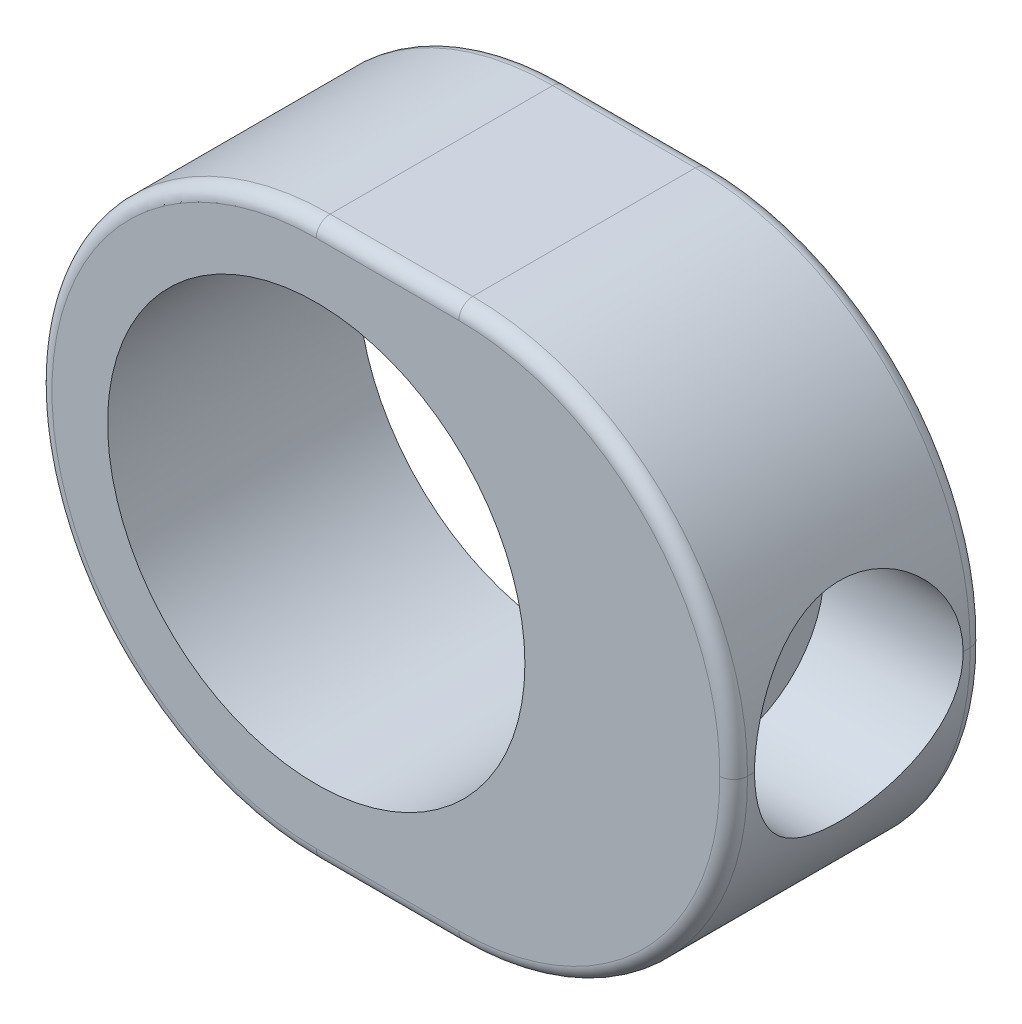
ISO-10303-21;
HEADER;
FILE_DESCRIPTION(('STEP AP214'),'2;1');
FILE_NAME('part.step','',(''),(''),'','','');
FILE_SCHEMA(('AUTOMOTIVE_DESIGN { 1 0 10303 214 1 1 1 1 }'));
ENDSEC;
DATA;
#1=APPLICATION_CONTEXT('core data for automotive mechanical design processes');
#2=APPLICATION_PROTOCOL_DEFINITION('international standard','automotive_design',2000,#1);
#3=PRODUCT_CONTEXT('',#1,'mechanical');
#4=PRODUCT('Part','Part','',(#3));
#5=PRODUCT_RELATED_PRODUCT_CATEGORY('part','',(#4));
#6=PRODUCT_DEFINITION_FORMATION('','',#4);
#7=PRODUCT_DEFINITION_CONTEXT('part definition',#1,'design');
#8=PRODUCT_DEFINITION('design','',#6,#7);
#9=PRODUCT_DEFINITION_SHAPE('','',#8);
#10=(LENGTH_UNIT() NAMED_UNIT(*) SI_UNIT(.MILLI.,.METRE.));
#11=(NAMED_UNIT(*) PLANE_ANGLE_UNIT() SI_UNIT($,.RADIAN.));
#12=(NAMED_UNIT(*) SI_UNIT($,.STERADIAN.) SOLID_ANGLE_UNIT());
#13=UNCERTAINTY_MEASURE_WITH_UNIT(LENGTH_MEASURE(1.E-05),#10,'distance_accuracy_value','');
#14=(GEOMETRIC_REPRESENTATION_CONTEXT(3) GLOBAL_UNCERTAINTY_ASSIGNED_CONTEXT((#13)) GLOBAL_UNIT_ASSIGNED_CONTEXT((#10,
#11,#12)) REPRESENTATION_CONTEXT('',''));
#15=CARTESIAN_POINT('',(0.,0.,0.));
#16=DIRECTION('',(0.,0.,1.));
#17=DIRECTION('',(1.,0.,0.));
#18=AXIS2_PLACEMENT_3D('',#15,#16,#17);
#19=CARTESIAN_POINT('',(20.503164683737,-0.5,18.));
#20=DIRECTION('',(0.,0.,-1.));
#21=DIRECTION('',(-1.,0.,0.));
#22=AXIS2_PLACEMENT_3D('',#19,#20,#21);
#23=CYLINDRICAL_SURFACE('',#22,39.5);
#24=DIRECTION('',(0.,0.,-1.));
#25=VECTOR('',#24,1.);
#26=CARTESIAN_POINT('',(20.503164683737,-40.,18.));
#27=LINE('',#26,#25);
#28=CARTESIAN_POINT('',(20.503164683737,-40.,16.));
#29=VERTEX_POINT('',#28);
#30=CARTESIAN_POINT('',(20.503164683737,-40.,-16.));
#31=VERTEX_POINT('',#30);
#32=EDGE_CURVE('E142',#29,#31,#27,.T.);
#33=ORIENTED_EDGE('',*,*,#32,.T.);
#34=CARTESIAN_POINT('',(20.503164683737,-0.5,-16.));
#35=DIRECTION('',(0.,0.,1.));
#36=DIRECTION('',(1.,0.,0.));
#37=AXIS2_PLACEMENT_3D('',#34,#35,#36);
#38=CIRCLE('',#37,39.5);
#39=CARTESIAN_POINT('',(60.,0.,-16.));
#40=VERTEX_POINT('',#39);
#41=EDGE_CURVE('E378',#31,#40,#38,.T.);
#42=ORIENTED_EDGE('',*,*,#41,.T.);
#43=DIRECTION('',(0.,0.,-1.));
#44=VECTOR('',#43,1.);
#45=CARTESIAN_POINT('',(60.,0.,18.));
#46=LINE('',#45,#44);
#47=CARTESIAN_POINT('',(60.,0.,-15.));
#48=VERTEX_POINT('',#47);
#49=EDGE_CURVE('E143',#48,#40,#46,.T.);
#50=ORIENTED_EDGE('',*,*,#49,.F.);
#51=CARTESIAN_POINT('',(60.,0.,15.));
#52=CARTESIAN_POINT('',(60.0025678408984,-0.20268748840878,15.0000006035009));
#53=CARTESIAN_POINT('',(60.0035706861601,-0.405368792643126,14.9958910075069));
#54=CARTESIAN_POINT('',(60.0024640671334,-0.810383275781215,14.9794646518959));
#55=CARTESIAN_POINT('',(60.0003547071752,-1.01271646612712,14.9671481674057));
#56=CARTESIAN_POINT('',(59.9893884076811,-1.6185191143819,14.9179233834016));
#57=CARTESIAN_POINT('',(59.9758956484686,-2.02098446942587,14.8687397254048));
#58=CARTESIAN_POINT('',(59.9370652817856,-2.81874161068317,14.7383042444344));
#59=CARTESIAN_POINT('',(59.911764894015,-3.2140519123791,14.6571533123197));
#60=CARTESIAN_POINT('',(59.8501007544488,-3.9960612184822,14.4635312373196));
#61=CARTESIAN_POINT('',(59.813736669792,-4.38275996342721,14.3510591521178));
#62=CARTESIAN_POINT('',(59.7310094212115,-5.14467215747707,14.0958745528617));
#63=CARTESIAN_POINT('',(59.6846521552448,-5.51989223274604,13.9531798769889));
#64=CARTESIAN_POINT('',(59.5831916526666,-6.25671936349273,13.6386924645677));
#65=CARTESIAN_POINT('',(59.5280879045826,-6.6183256213372,13.4668980262975));
#66=CARTESIAN_POINT('',(59.4105613327311,-7.32592096774218,13.0954434953834));
#67=CARTESIAN_POINT('',(59.348134687917,-7.67190177145621,12.8957688445662));
#68=CARTESIAN_POINT('',(59.2175903640913,-8.34609213756379,12.4700323675246));
#69=CARTESIAN_POINT('',(59.1494725428876,-8.67430125560011,12.2439698819533));
#70=CARTESIAN_POINT('',(59.0066916983673,-9.32284915792936,11.7581714700518));
#71=CARTESIAN_POINT('',(58.9318802788839,-9.64245839174393,11.4975049331854));
#72=CARTESIAN_POINT('',(58.7799619017773,-10.2589781702006,10.9509431826881));
#73=CARTESIAN_POINT('',(58.7028539651049,-10.5558788355795,10.6650371039159));
#74=CARTESIAN_POINT('',(58.5484201756727,-11.1252332364311,10.0697013641065));
#75=CARTESIAN_POINT('',(58.4710942585987,-11.3976787539636,9.76026385958395));
#76=CARTESIAN_POINT('',(58.3183948077789,-11.9162788970213,9.11986799047147));
#77=CARTESIAN_POINT('',(58.2430204504717,-12.1624447542387,8.78891891782194));
#78=CARTESIAN_POINT('',(58.0933312439587,-12.6364593130683,8.09345750748559));
#79=CARTESIAN_POINT('',(58.0191823945208,-12.8631652971093,7.72812921123432));
#80=CARTESIAN_POINT('',(57.8775762140241,-13.2848685841253,6.97834297436058));
#81=CARTESIAN_POINT('',(57.810119101712,-13.4798648506714,6.59388440900346));
#82=CARTESIAN_POINT('',(57.6841401389698,-13.8364476415856,5.80849729179803));
#83=CARTESIAN_POINT('',(57.6256154287768,-13.9980448647536,5.40757406360042));
#84=CARTESIAN_POINT('',(57.5195020787645,-14.2863846350347,4.59197832011602));
#85=CARTESIAN_POINT('',(57.471912844006,-14.4131290783702,4.17730655421699));
#86=CARTESIAN_POINT('',(57.3909207429949,-14.6264287349907,3.35292186150705));
#87=CARTESIAN_POINT('',(57.3570575980606,-14.7142989756503,2.94359442968668));
#88=CARTESIAN_POINT('',(57.3022506570644,-14.8555925359863,2.11817561556694));
#89=CARTESIAN_POINT('',(57.2813065669747,-14.9090166396313,1.70208438742757));
#90=CARTESIAN_POINT('',(57.2530963991491,-14.9808153582694,0.86656178410691));
#91=CARTESIAN_POINT('',(57.2458258447524,-14.9992014445948,0.447131547282433));
#92=CARTESIAN_POINT('',(57.2452159465281,-15.0007475212642,-0.391795779949764));
#93=CARTESIAN_POINT('',(57.2518760695792,-14.9839088596444,-0.811292867184814));
#94=CARTESIAN_POINT('',(57.2780946449758,-14.9172013706989,-1.62267419420308));
#95=CARTESIAN_POINT('',(57.2968818593942,-14.8693068067355,-2.01474766553545));
#96=CARTESIAN_POINT('',(57.345991350649,-14.7429180443422,-2.79317697717157));
#97=CARTESIAN_POINT('',(57.376313117744,-14.6644251981248,-3.17953306935715));
#98=CARTESIAN_POINT('',(57.4475505278599,-14.4775653692412,-3.94397630277603));
#99=CARTESIAN_POINT('',(57.4884671093371,-14.3691957401261,-4.3220627082869));
#100=CARTESIAN_POINT('',(57.5796628247883,-14.1235250570078,-5.06755185128892));
#101=CARTESIAN_POINT('',(57.6299422515786,-13.9862230981495,-5.43495425423008));
#102=CARTESIAN_POINT('',(57.7393557146436,-13.6811522582491,-6.16316573259671));
#103=CARTESIAN_POINT('',(57.7986283556239,-13.5128957004934,-6.52374951130485));
#104=CARTESIAN_POINT('',(57.9236923305531,-13.148761324539,-7.22965169369374));
#105=CARTESIAN_POINT('',(57.9894858786148,-12.9528741149922,-7.57496485442802));
#106=CARTESIAN_POINT('',(58.1257851505681,-12.5348142728184,-8.2483641457647));
#107=CARTESIAN_POINT('',(58.1962914189855,-12.3126386004289,-8.57644827781133));
#108=CARTESIAN_POINT('',(58.34015748141,-11.8433766730301,-9.21363115173639));
#109=CARTESIAN_POINT('',(58.4135173925975,-11.5962893943987,-9.52272911262954));
#110=CARTESIAN_POINT('',(58.5659889913566,-11.0618885680037,-10.1396110455137));
#111=CARTESIAN_POINT('',(58.6451663733164,-10.7730081468667,-10.4460232353462));
#112=CARTESIAN_POINT('',(58.8023705607463,-10.1704565918904,-11.0335318054083));
#113=CARTESIAN_POINT('',(58.8803977129236,-9.85679311738492,-11.3146359502068));
#114=CARTESIAN_POINT('',(59.0331783685077,-9.20630193525748,-11.8499578740072));
#115=CARTESIAN_POINT('',(59.1079303762142,-8.8694638210079,-12.1041634423752));
#116=CARTESIAN_POINT('',(59.2520177137397,-8.17477721865735,-12.5837657413823));
#117=CARTESIAN_POINT('',(59.321353206732,-7.81692936404712,-12.8091633399958));
#118=CARTESIAN_POINT('',(59.4534899307952,-7.07761233527592,-13.2322010229482));
#119=CARTESIAN_POINT('',(59.5161936033943,-6.69589502810454,-13.4294385575695));
#120=CARTESIAN_POINT('',(59.6321282317366,-5.9156945780758,-13.790917935437));
#121=CARTESIAN_POINT('',(59.6853581605179,-5.51720962337307,-13.955156201783));
#122=CARTESIAN_POINT('',(59.7806172694807,-4.70688600262124,-14.2488837392368));
#123=CARTESIAN_POINT('',(59.8226604718654,-4.29506478679739,-14.3784165139975));
#124=CARTESIAN_POINT('',(59.8942539054707,-3.46095530039465,-14.60164822741));
#125=CARTESIAN_POINT('',(59.9238094526484,-3.03867156488987,-14.6953624123033));
#126=CARTESIAN_POINT('',(59.9696972067402,-2.18190654576166,-14.846905383133));
#127=CARTESIAN_POINT('',(59.9858738293944,-1.74734090792212,-14.9043101682281));
#128=CARTESIAN_POINT('',(59.9993140623349,-1.0931391194621,-14.9617169610482));
#129=CARTESIAN_POINT('',(60.0019912112039,-0.874775322800255,-14.9760691494335));
#130=CARTESIAN_POINT('',(60.0037205260251,-0.437610973492026,-14.9952111403534));
#131=CARTESIAN_POINT('',(60.0027726295353,-0.218810413387182,-15.0000007781688));
#132=CARTESIAN_POINT('',(60.,0.,-15.));
#133=B_SPLINE_CURVE_WITH_KNOTS('',3,(#51,#52,#53,#54,#55,#56,#57,#58,#59,#60,#61,#62,#63,#64,
#65,#66,#67,#68,#69,#70,#71,#72,#73,#74,#75,#76,#77,#78,#79,#80,#81,#82,#83,#84,#85,#86,#87,#88,
#89,#90,#91,#92,#93,#94,#95,#96,#97,#98,#99,#100,#101,#102,#103,#104,#105,#106,#107,#108,#109,
#110,#111,#112,#113,#114,#115,#116,#117,#118,#119,#120,#121,#122,#123,#124,#125,#126,#127,#128,
#129,#130,#131,#132),.UNSPECIFIED.,.F.,.F.,(4,2,2,2,2,2,2,2,2,2,2,2,2,2,2,2,2,2,2,2,2,2,2,2,2,2,
2,2,2,2,2,2,2,2,2,2,2,2,2,2,4),(0.,0.608011795434432,1.2160032089834,2.43140949498945,
3.64301022082166,4.8546474023587,6.06557142625138,7.2765662880902,8.48819587486417,
9.69985574283849,10.9559322371555,12.212552110038,13.4695926904939,14.7260938538559,
16.0333879945179,17.3407248553654,18.6476422823995,19.9544885903799,21.2129162929076,
22.4713153535391,23.7293023476037,24.9872411999143,26.1721524130091,27.3570112679331,
28.541975109951,29.7269760170751,30.9325554372453,32.1385456121519,33.3446753734882,
34.5508547151024,35.8348649800721,37.1184799555221,38.4026751516968,39.686831646376,
40.9878199672855,42.2889492306532,43.5884398039017,44.8873766292223,46.2012145204661,
46.8575615635148,47.513919912335),.UNSPECIFIED.);
#134=CARTESIAN_POINT('',(60.,0.,15.));
#135=VERTEX_POINT('',#134);
#136=EDGE_CURVE('E147',#135,#48,#133,.T.);
#137=ORIENTED_EDGE('',*,*,#136,.F.);
#138=CARTESIAN_POINT('',(60.,0.,16.));
#139=VERTEX_POINT('',#138);
#140=EDGE_CURVE('E130',#139,#135,#46,.T.);
#141=ORIENTED_EDGE('',*,*,#140,.F.);
#142=CARTESIAN_POINT('',(20.503164683737,-0.5,16.));
#143=DIRECTION('',(0.,0.,1.));
#144=DIRECTION('',(1.,0.,0.));
#145=AXIS2_PLACEMENT_3D('',#142,#143,#144);
#146=CIRCLE('',#145,39.5);
#147=EDGE_CURVE('E374',#139,#29,#146,.F.);
#148=ORIENTED_EDGE('',*,*,#147,.T.);
#149=EDGE_LOOP('',(#33,#42,#50,#137,#141,#148));
#150=FACE_BOUND('',#149,.T.);
#151=ADVANCED_FACE('F45',(#150),#23,.T.);
#152=CARTESIAN_POINT('',(20.503164683737,0.5,18.));
#153=DIRECTION('',(0.,0.,-1.));
#154=DIRECTION('',(-1.,0.,0.));
#155=AXIS2_PLACEMENT_3D('',#152,#153,#154);
#156=CYLINDRICAL_SURFACE('',#155,39.5);
#157=ORIENTED_EDGE('',*,*,#49,.T.);
#158=CARTESIAN_POINT('',(20.503164683737,0.5,-16.));
#159=DIRECTION('',(0.,0.,1.));
#160=DIRECTION('',(1.,0.,0.));
#161=AXIS2_PLACEMENT_3D('',#158,#159,#160);
#162=CIRCLE('',#161,39.5);
#163=CARTESIAN_POINT('',(20.503164683737,40.,-16.));
#164=VERTEX_POINT('',#163);
#165=EDGE_CURVE('E377',#40,#164,#162,.T.);
#166=ORIENTED_EDGE('',*,*,#165,.T.);
#167=DIRECTION('',(0.,0.,-1.));
#168=VECTOR('',#167,1.);
#169=CARTESIAN_POINT('',(20.503164683737,40.,18.));
#170=LINE('',#169,#168);
#171=CARTESIAN_POINT('',(20.503164683737,40.,16.));
#172=VERTEX_POINT('',#171);
#173=EDGE_CURVE('E392',#172,#164,#170,.T.);
#174=ORIENTED_EDGE('',*,*,#173,.F.);
#175=CARTESIAN_POINT('',(20.503164683737,0.5,16.));
#176=DIRECTION('',(0.,0.,1.));
#177=DIRECTION('',(1.,0.,0.));
#178=AXIS2_PLACEMENT_3D('',#175,#176,#177);
#179=CIRCLE('',#178,39.5);
#180=EDGE_CURVE('E138',#172,#139,#179,.F.);
#181=ORIENTED_EDGE('',*,*,#180,.T.);
#182=ORIENTED_EDGE('',*,*,#140,.T.);
#183=CARTESIAN_POINT('',(60.,0.,-15.));
#184=CARTESIAN_POINT('',(60.0025678408984,0.202687488408824,-15.0000006035009));
#185=CARTESIAN_POINT('',(60.0035706861601,0.405368792643171,-14.9958910075069));
#186=CARTESIAN_POINT('',(60.0024640671334,0.81038327578126,-14.9794646518959));
#187=CARTESIAN_POINT('',(60.0003547071752,1.01271646612717,-14.9671481674057));
#188=CARTESIAN_POINT('',(59.9893884076811,1.61851911438194,-14.9179233834016));
#189=CARTESIAN_POINT('',(59.9758956484686,2.02098446942592,-14.8687397254048));
#190=CARTESIAN_POINT('',(59.9370652817856,2.81874161068322,-14.7383042444344));
#191=CARTESIAN_POINT('',(59.911764894015,3.21405191237915,-14.6571533123197));
#192=CARTESIAN_POINT('',(59.8501007544488,3.99606121848224,-14.4635312373196));
#193=CARTESIAN_POINT('',(59.813736669792,4.38275996342725,-14.3510591521178));
#194=CARTESIAN_POINT('',(59.7310094212115,5.14467215747711,-14.0958745528616));
#195=CARTESIAN_POINT('',(59.6846521552448,5.51989223274608,-13.9531798769889));
#196=CARTESIAN_POINT('',(59.5831916526666,6.25671936349277,-13.6386924645677));
#197=CARTESIAN_POINT('',(59.5280879045826,6.61832562133724,-13.4668980262975));
#198=CARTESIAN_POINT('',(59.4105613327311,7.32592096774222,-13.0954434953834));
#199=CARTESIAN_POINT('',(59.348134687917,7.67190177145625,-12.8957688445662));
#200=CARTESIAN_POINT('',(59.2175903640913,8.34609213756382,-12.4700323675246));
#201=CARTESIAN_POINT('',(59.1494725428876,8.67430125560015,-12.2439698819532));
#202=CARTESIAN_POINT('',(59.0066916983673,9.3228491579294,-11.7581714700518));
#203=CARTESIAN_POINT('',(58.9318802788838,9.64245839174396,-11.4975049331854));
#204=CARTESIAN_POINT('',(58.7799619017773,10.2589781702006,-10.950943182688));
#205=CARTESIAN_POINT('',(58.7028539651049,10.5558788355796,-10.6650371039159));
#206=CARTESIAN_POINT('',(58.5484201756727,11.1252332364312,-10.0697013641064));
#207=CARTESIAN_POINT('',(58.4710942585987,11.3976787539637,-9.76026385958391));
#208=CARTESIAN_POINT('',(58.3183948077789,11.9162788970214,-9.11986799047143));
#209=CARTESIAN_POINT('',(58.2430204504717,12.1624447542388,-8.7889189178219));
#210=CARTESIAN_POINT('',(58.0933312439587,12.6364593130683,-8.09345750748554));
#211=CARTESIAN_POINT('',(58.0191823945208,12.8631652971094,-7.72812921123428));
#212=CARTESIAN_POINT('',(57.8775762140241,13.2848685841253,-6.97834297436054));
#213=CARTESIAN_POINT('',(57.810119101712,13.4798648506714,-6.59388440900342));
#214=CARTESIAN_POINT('',(57.6841401389698,13.8364476415856,-5.80849729179799));
#215=CARTESIAN_POINT('',(57.6256154287768,13.9980448647536,-5.40757406360037));
#216=CARTESIAN_POINT('',(57.5195020787645,14.2863846350347,-4.59197832011597));
#217=CARTESIAN_POINT('',(57.471912844006,14.4131290783703,-4.17730655421694));
#218=CARTESIAN_POINT('',(57.3909207429949,14.6264287349907,-3.352921861507));
#219=CARTESIAN_POINT('',(57.3570575980606,14.7142989756503,-2.94359442968663));
#220=CARTESIAN_POINT('',(57.3022506570644,14.8555925359863,-2.11817561556689));
#221=CARTESIAN_POINT('',(57.2813065669747,14.9090166396313,-1.70208438742751));
#222=CARTESIAN_POINT('',(57.2530963991491,14.9808153582694,-0.866561784106857));
#223=CARTESIAN_POINT('',(57.2458258447524,14.9992014445948,-0.44713154728238));
#224=CARTESIAN_POINT('',(57.2452159465281,15.0007475212642,0.391795779949815));
#225=CARTESIAN_POINT('',(57.2518760695792,14.9839088596444,0.811292867184864));
#226=CARTESIAN_POINT('',(57.2780946449758,14.9172013706989,1.62267419420313));
#227=CARTESIAN_POINT('',(57.2968818593942,14.8693068067355,2.0147476655355));
#228=CARTESIAN_POINT('',(57.345991350649,14.7429180443422,2.79317697717162));
#229=CARTESIAN_POINT('',(57.376313117744,14.6644251981248,3.17953306935719));
#230=CARTESIAN_POINT('',(57.4475505278599,14.4775653692412,3.94397630277608));
#231=CARTESIAN_POINT('',(57.4884671093371,14.3691957401261,4.32206270828695));
#232=CARTESIAN_POINT('',(57.5796628247883,14.1235250570078,5.06755185128897));
#233=CARTESIAN_POINT('',(57.6299422515786,13.9862230981495,5.43495425423013));
#234=CARTESIAN_POINT('',(57.7393557146436,13.6811522582491,6.16316573259676));
#235=CARTESIAN_POINT('',(57.7986283556239,13.5128957004933,6.52374951130489));
#236=CARTESIAN_POINT('',(57.9236923305531,13.148761324539,7.22965169369379));
#237=CARTESIAN_POINT('',(57.9894858786148,12.9528741149922,7.57496485442806));
#238=CARTESIAN_POINT('',(58.1257851505681,12.5348142728183,8.24836414576474));
#239=CARTESIAN_POINT('',(58.1962914189855,12.3126386004289,8.57644827781138));
#240=CARTESIAN_POINT('',(58.34015748141,11.84337667303,9.21363115173643));
#241=CARTESIAN_POINT('',(58.4135173925975,11.5962893943987,9.52272911262958));
#242=CARTESIAN_POINT('',(58.5659889913566,11.0618885680037,10.1396110455137));
#243=CARTESIAN_POINT('',(58.6451663733164,10.7730081468667,10.4460232353462));
#244=CARTESIAN_POINT('',(58.8023705607463,10.1704565918903,11.0335318054083));
#245=CARTESIAN_POINT('',(58.8803977129236,9.85679311738488,11.3146359502069));
#246=CARTESIAN_POINT('',(59.0331783685077,9.20630193525744,11.8499578740072));
#247=CARTESIAN_POINT('',(59.1079303762143,8.86946382100786,12.1041634423752));
#248=CARTESIAN_POINT('',(59.2520177137397,8.17477721865731,12.5837657413823));
#249=CARTESIAN_POINT('',(59.321353206732,7.81692936404707,12.8091633399958));
#250=CARTESIAN_POINT('',(59.4534899307952,7.07761233527587,13.2322010229482));
#251=CARTESIAN_POINT('',(59.5161936033943,6.6958950281045,13.4294385575695));
#252=CARTESIAN_POINT('',(59.6321282317366,5.91569457807575,13.790917935437));
#253=CARTESIAN_POINT('',(59.6853581605179,5.51720962337302,13.9551562017831));
#254=CARTESIAN_POINT('',(59.7806172694807,4.70688600262119,14.2488837392369));
#255=CARTESIAN_POINT('',(59.8226604718654,4.29506478679734,14.3784165139975));
#256=CARTESIAN_POINT('',(59.8942539054707,3.4609553003946,14.60164822741));
#257=CARTESIAN_POINT('',(59.9238094526484,3.03867156488982,14.6953624123033));
#258=CARTESIAN_POINT('',(59.9696972067402,2.18190654576163,14.846905383133));
#259=CARTESIAN_POINT('',(59.9858738293944,1.7473409079221,14.9043101682281));
#260=CARTESIAN_POINT('',(59.9993140623349,1.09313911946211,14.9617169610482));
#261=CARTESIAN_POINT('',(60.0019912112039,0.874775322800274,14.9760691494335));
#262=CARTESIAN_POINT('',(60.0037205260251,0.437610973492057,14.9952111403534));
#263=CARTESIAN_POINT('',(60.0027726295353,0.218810413387221,15.0000007781688));
#264=CARTESIAN_POINT('',(60.,0.,15.));
#265=B_SPLINE_CURVE_WITH_KNOTS('',3,(#183,#184,#185,#186,#187,#188,#189,#190,#191,#192,#193,
#194,#195,#196,#197,#198,#199,#200,#201,#202,#203,#204,#205,#206,#207,#208,#209,#210,#211,#212,
#213,#214,#215,#216,#217,#218,#219,#220,#221,#222,#223,#224,#225,#226,#227,#228,#229,#230,#231,
#232,#233,#234,#235,#236,#237,#238,#239,#240,#241,#242,#243,#244,#245,#246,#247,#248,#249,#250,
#251,#252,#253,#254,#255,#256,#257,#258,#259,#260,#261,#262,#263,#264),.UNSPECIFIED.,.F.,.F.,(4,
2,2,2,2,2,2,2,2,2,2,2,2,2,2,2,2,2,2,2,2,2,2,2,2,2,2,2,2,2,2,2,2,2,2,2,2,2,2,2,4),(0.,
0.608011795434432,1.2160032089834,2.43140949498945,3.64301022082166,4.8546474023587,
6.06557142625137,7.2765662880902,8.48819587486417,9.69985574283849,10.9559322371555,
12.212552110038,13.4695926904939,14.7260938538559,16.0333879945179,17.3407248553655,
18.6476422823995,19.9544885903799,21.2129162929076,22.4713153535391,23.7293023476037,
24.9872411999143,26.1721524130091,27.3570112679332,28.541975109951,29.7269760170751,
30.9325554372453,32.1385456121519,33.3446753734882,34.5508547151024,35.8348649800721,
37.1184799555221,38.4026751516968,39.686831646376,40.9878199672855,42.2889492306532,
43.5884398039017,44.8873766292223,46.2012145204661,46.8575615635147,47.513919912335),.UNSPECIFIED.);
#266=EDGE_CURVE('E134',#48,#135,#265,.T.);
#267=ORIENTED_EDGE('',*,*,#266,.F.);
#268=EDGE_LOOP('',(#157,#166,#174,#181,#182,#267));
#269=FACE_BOUND('',#268,.T.);
#270=ADVANCED_FACE('F133',(#269),#156,.T.);
#271=CARTESIAN_POINT('',(0.,0.,18.));
#272=DIRECTION('',(0.,0.,1.));
#273=DIRECTION('',(1.,0.,0.));
#274=AXIS2_PLACEMENT_3D('',#271,#272,#273);
#275=PLANE('',#274);
#276=CARTESIAN_POINT('',(20.503164683737,-0.5,18.));
#277=DIRECTION('',(0.,0.,1.));
#278=DIRECTION('',(1.,0.,0.));
#279=AXIS2_PLACEMENT_3D('',#276,#277,#278);
#280=CIRCLE('',#279,37.5);
#281=CARTESIAN_POINT('',(20.503164683737,-38.,18.));
#282=VERTEX_POINT('',#281);
#283=CARTESIAN_POINT('',(57.9998312022424,0.,18.));
#284=VERTEX_POINT('',#283);
#285=EDGE_CURVE('E55',#282,#284,#280,.T.);
#286=ORIENTED_EDGE('',*,*,#285,.T.);
#287=CARTESIAN_POINT('',(20.503164683737,0.5,18.));
#288=DIRECTION('',(0.,0.,1.));
#289=DIRECTION('',(1.,0.,0.));
#290=AXIS2_PLACEMENT_3D('',#287,#288,#289);
#291=CIRCLE('',#290,37.5);
#292=CARTESIAN_POINT('',(20.503164683737,38.,18.));
#293=VERTEX_POINT('',#292);
#294=EDGE_CURVE('E11',#284,#293,#291,.T.);
#295=ORIENTED_EDGE('',*,*,#294,.T.);
#296=DIRECTION('',(-1.,0.,0.));
#297=VECTOR('',#296,1.);
#298=CARTESIAN_POINT('',(0.,38.,18.));
#299=LINE('',#298,#297);
#300=CARTESIAN_POINT('',(0.,38.,18.));
#301=VERTEX_POINT('',#300);
#302=EDGE_CURVE('E352',#293,#301,#299,.T.);
#303=ORIENTED_EDGE('',*,*,#302,.T.);
#304=CARTESIAN_POINT('',(0.,0.,18.));
#305=DIRECTION('',(0.,0.,1.));
#306=DIRECTION('',(1.,0.,0.));
#307=AXIS2_PLACEMENT_3D('',#304,#305,#306);
#308=CIRCLE('',#307,38.);
#309=CARTESIAN_POINT('',(0.,-38.,18.));
#310=VERTEX_POINT('',#309);
#311=EDGE_CURVE('E337',#301,#310,#308,.T.);
#312=ORIENTED_EDGE('',*,*,#311,.T.);
#313=DIRECTION('',(1.,0.,0.));
#314=VECTOR('',#313,1.);
#315=CARTESIAN_POINT('',(20.503164683737,-38.,18.));
#316=LINE('',#315,#314);
#317=EDGE_CURVE('E66',#310,#282,#316,.T.);
#318=ORIENTED_EDGE('',*,*,#317,.T.);
#319=EDGE_LOOP('',(#286,#295,#303,#312,#318));
#320=FACE_BOUND('',#319,.T.);
#321=CARTESIAN_POINT('',(0.,0.,18.));
#322=DIRECTION('',(0.,0.,1.));
#323=DIRECTION('',(1.,0.,0.));
#324=AXIS2_PLACEMENT_3D('',#321,#322,#323);
#325=CIRCLE('',#324,30.);
#326=CARTESIAN_POINT('',(30.,0.,18.));
#327=VERTEX_POINT('',#326);
#328=EDGE_CURVE('E160',#327,#327,#325,.T.);
#329=ORIENTED_EDGE('',*,*,#328,.F.);
#330=EDGE_LOOP('',(#329));
#331=FACE_BOUND('',#330,.T.);
#332=ADVANCED_FACE('F195',(#320,#331),#275,.T.);
#333=CARTESIAN_POINT('',(0.,0.,-18.));
#334=DIRECTION('',(0.,0.,1.));
#335=DIRECTION('',(1.,0.,0.));
#336=AXIS2_PLACEMENT_3D('',#333,#334,#335);
#337=PLANE('',#336);
#338=CARTESIAN_POINT('',(20.503164683737,-0.5,-18.));
#339=DIRECTION('',(0.,0.,1.));
#340=DIRECTION('',(1.,0.,0.));
#341=AXIS2_PLACEMENT_3D('',#338,#339,#340);
#342=CIRCLE('',#341,37.5);
#343=CARTESIAN_POINT('',(57.9998312022424,0.,-18.));
#344=VERTEX_POINT('',#343);
#345=CARTESIAN_POINT('',(20.503164683737,-38.,-18.));
#346=VERTEX_POINT('',#345);
#347=EDGE_CURVE('E425',#344,#346,#342,.F.);
#348=ORIENTED_EDGE('',*,*,#347,.T.);
#349=DIRECTION('',(1.,0.,0.));
#350=VECTOR('',#349,1.);
#351=CARTESIAN_POINT('',(0.,-38.,-18.));
#352=LINE('',#351,#350);
#353=CARTESIAN_POINT('',(0.,-38.,-18.));
#354=VERTEX_POINT('',#353);
#355=EDGE_CURVE('E428',#346,#354,#352,.F.);
#356=ORIENTED_EDGE('',*,*,#355,.T.);
#357=CARTESIAN_POINT('',(0.,0.,-18.));
#358=DIRECTION('',(0.,0.,1.));
#359=DIRECTION('',(1.,0.,0.));
#360=AXIS2_PLACEMENT_3D('',#357,#358,#359);
#361=CIRCLE('',#360,38.);
#362=CARTESIAN_POINT('',(0.,38.,-18.));
#363=VERTEX_POINT('',#362);
#364=EDGE_CURVE('E408',#354,#363,#361,.F.);
#365=ORIENTED_EDGE('',*,*,#364,.T.);
#366=DIRECTION('',(-1.,0.,0.));
#367=VECTOR('',#366,1.);
#368=CARTESIAN_POINT('',(0.,38.,-18.));
#369=LINE('',#368,#367);
#370=CARTESIAN_POINT('',(20.503164683737,38.,-18.));
#371=VERTEX_POINT('',#370);
#372=EDGE_CURVE('E415',#363,#371,#369,.F.);
#373=ORIENTED_EDGE('',*,*,#372,.T.);
#374=CARTESIAN_POINT('',(20.503164683737,0.5,-18.));
#375=DIRECTION('',(0.,0.,1.));
#376=DIRECTION('',(1.,0.,0.));
#377=AXIS2_PLACEMENT_3D('',#374,#375,#376);
#378=CIRCLE('',#377,37.5);
#379=EDGE_CURVE('E422',#371,#344,#378,.F.);
#380=ORIENTED_EDGE('',*,*,#379,.T.);
#381=EDGE_LOOP('',(#348,#356,#365,#373,#380));
#382=FACE_BOUND('',#381,.T.);
#383=CARTESIAN_POINT('',(0.,0.,-18.));
#384=DIRECTION('',(0.,0.,1.));
#385=DIRECTION('',(1.,0.,0.));
#386=AXIS2_PLACEMENT_3D('',#383,#384,#385);
#387=CIRCLE('',#386,30.);
#388=CARTESIAN_POINT('',(30.,0.,-18.));
#389=VERTEX_POINT('',#388);
#390=EDGE_CURVE('E154',#389,#389,#387,.T.);
#391=ORIENTED_EDGE('',*,*,#390,.T.);
#392=EDGE_LOOP('',(#391));
#393=FACE_BOUND('',#392,.T.);
#394=ADVANCED_FACE('F201',(#382,#393),#337,.F.);
#395=CARTESIAN_POINT('',(0.,0.,18.));
#396=DIRECTION('',(0.,0.,-1.));
#397=DIRECTION('',(-1.,0.,0.));
#398=AXIS2_PLACEMENT_3D('',#395,#396,#397);
#399=CYLINDRICAL_SURFACE('',#398,40.);
#400=DIRECTION('',(0.,0.,-1.));
#401=VECTOR('',#400,1.);
#402=CARTESIAN_POINT('',(0.,40.,18.));
#403=LINE('',#402,#401);
#404=CARTESIAN_POINT('',(0.,40.,16.));
#405=VERTEX_POINT('',#404);
#406=CARTESIAN_POINT('',(0.,40.,-16.));
#407=VERTEX_POINT('',#406);
#408=EDGE_CURVE('E387',#405,#407,#403,.T.);
#409=ORIENTED_EDGE('',*,*,#408,.T.);
#410=CARTESIAN_POINT('',(0.,0.,-16.));
#411=DIRECTION('',(0.,0.,1.));
#412=DIRECTION('',(1.,0.,0.));
#413=AXIS2_PLACEMENT_3D('',#410,#411,#412);
#414=CIRCLE('',#413,40.);
#415=CARTESIAN_POINT('',(0.,-40.,-16.));
#416=VERTEX_POINT('',#415);
#417=EDGE_CURVE('E358',#407,#416,#414,.T.);
#418=ORIENTED_EDGE('',*,*,#417,.T.);
#419=DIRECTION('',(0.,0.,-1.));
#420=VECTOR('',#419,1.);
#421=CARTESIAN_POINT('',(0.,-40.,18.));
#422=LINE('',#421,#420);
#423=CARTESIAN_POINT('',(0.,-40.,16.));
#424=VERTEX_POINT('',#423);
#425=EDGE_CURVE('E150',#424,#416,#422,.T.);
#426=ORIENTED_EDGE('',*,*,#425,.F.);
#427=CARTESIAN_POINT('',(0.,0.,16.));
#428=DIRECTION('',(0.,0.,1.));
#429=DIRECTION('',(1.,0.,0.));
#430=AXIS2_PLACEMENT_3D('',#427,#428,#429);
#431=CIRCLE('',#430,40.);
#432=EDGE_CURVE('E339',#424,#405,#431,.F.);
#433=ORIENTED_EDGE('',*,*,#432,.T.);
#434=EDGE_LOOP('',(#409,#418,#426,#433));
#435=FACE_BOUND('',#434,.T.);
#436=ADVANCED_FACE('F203',(#435),#399,.T.);
#437=CARTESIAN_POINT('',(0.,-40.,18.));
#438=DIRECTION('',(0.,1.,0.));
#439=DIRECTION('',(0.,0.,1.));
#440=AXIS2_PLACEMENT_3D('',#437,#438,#439);
#441=PLANE('',#440);
#442=ORIENTED_EDGE('',*,*,#425,.T.);
#443=DIRECTION('',(1.,0.,0.));
#444=VECTOR('',#443,1.);
#445=CARTESIAN_POINT('',(0.,-40.,-16.));
#446=LINE('',#445,#444);
#447=EDGE_CURVE('E404',#416,#31,#446,.T.);
#448=ORIENTED_EDGE('',*,*,#447,.T.);
#449=ORIENTED_EDGE('',*,*,#32,.F.);
#450=DIRECTION('',(1.,0.,0.));
#451=VECTOR('',#450,1.);
#452=CARTESIAN_POINT('',(0.,-40.,16.));
#453=LINE('',#452,#451);
#454=EDGE_CURVE('E149',#29,#424,#453,.F.);
#455=ORIENTED_EDGE('',*,*,#454,.T.);
#456=EDGE_LOOP('',(#442,#448,#449,#455));
#457=FACE_BOUND('',#456,.T.);
#458=ADVANCED_FACE('F199',(#457),#441,.F.);
#459=CARTESIAN_POINT('',(0.,40.,18.));
#460=DIRECTION('',(0.,-1.,0.));
#461=DIRECTION('',(0.,0.,-1.));
#462=AXIS2_PLACEMENT_3D('',#459,#460,#461);
#463=PLANE('',#462);
#464=ORIENTED_EDGE('',*,*,#173,.T.);
#465=DIRECTION('',(-1.,0.,0.));
#466=VECTOR('',#465,1.);
#467=CARTESIAN_POINT('',(0.,40.,-16.));
#468=LINE('',#467,#466);
#469=EDGE_CURVE('E357',#164,#407,#468,.T.);
#470=ORIENTED_EDGE('',*,*,#469,.T.);
#471=ORIENTED_EDGE('',*,*,#408,.F.);
#472=DIRECTION('',(-1.,0.,0.));
#473=VECTOR('',#472,1.);
#474=CARTESIAN_POINT('',(20.503164683737,40.,16.));
#475=LINE('',#474,#473);
#476=EDGE_CURVE('E353',#405,#172,#475,.F.);
#477=ORIENTED_EDGE('',*,*,#476,.T.);
#478=EDGE_LOOP('',(#464,#470,#471,#477));
#479=FACE_BOUND('',#478,.T.);
#480=ADVANCED_FACE('F196',(#479),#463,.F.);
#481=CARTESIAN_POINT('',(0.,0.,18.));
#482=DIRECTION('',(0.,0.,-1.));
#483=DIRECTION('',(-1.,0.,0.));
#484=AXIS2_PLACEMENT_3D('',#481,#482,#483);
#485=CYLINDRICAL_SURFACE('',#484,30.);
#486=ORIENTED_EDGE('',*,*,#328,.T.);
#487=EDGE_LOOP('',(#486));
#488=FACE_BOUND('',#487,.T.);
#489=ORIENTED_EDGE('',*,*,#390,.F.);
#490=EDGE_LOOP('',(#489));
#491=FACE_BOUND('',#490,.T.);
#492=ADVANCED_FACE('F180',(#488,#491),#485,.F.);
#493=CARTESIAN_POINT('',(60.003164683737,0.,0.));
#494=DIRECTION('',(-1.,0.,0.));
#495=DIRECTION('',(0.,0.,1.));
#496=AXIS2_PLACEMENT_3D('',#493,#494,#495);
#497=CYLINDRICAL_SURFACE('',#496,15.);
#498=CARTESIAN_POINT('',(40.,0.,0.));
#499=DIRECTION('',(1.,0.,0.));
#500=DIRECTION('',(0.,0.,-1.));
#501=AXIS2_PLACEMENT_3D('',#498,#499,#500);
#502=CIRCLE('',#501,15.);
#503=CARTESIAN_POINT('',(40.,0.,-15.));
#504=VERTEX_POINT('',#503);
#505=EDGE_CURVE('E155',#504,#504,#502,.T.);
#506=ORIENTED_EDGE('',*,*,#505,.F.);
#507=EDGE_LOOP('',(#506));
#508=FACE_BOUND('',#507,.T.);
#509=ORIENTED_EDGE('',*,*,#136,.T.);
#510=ORIENTED_EDGE('',*,*,#266,.T.);
#511=EDGE_LOOP('',(#509,#510));
#512=FACE_BOUND('',#511,.T.);
#513=ADVANCED_FACE('F146',(#508,#512),#497,.F.);
#514=CARTESIAN_POINT('',(40.,0.,0.));
#515=DIRECTION('',(1.,0.,0.));
#516=DIRECTION('',(0.,0.,-1.));
#517=AXIS2_PLACEMENT_3D('',#514,#515,#516);
#518=PLANE('',#517);
#519=ORIENTED_EDGE('',*,*,#505,.T.);
#520=EDGE_LOOP('',(#519));
#521=FACE_BOUND('',#520,.T.);
#522=ADVANCED_FACE('F179',(#521),#518,.T.);
#523=CARTESIAN_POINT('',(0.,38.,-16.));
#524=DIRECTION('',(-1.,0.,0.));
#525=DIRECTION('',(0.,0.,1.));
#526=AXIS2_PLACEMENT_3D('',#523,#524,#525);
#527=CYLINDRICAL_SURFACE('',#526,2.);
#528=CARTESIAN_POINT('',(0.,38.,-16.));
#529=DIRECTION('',(-1.,0.,0.));
#530=DIRECTION('',(0.,0.,1.));
#531=AXIS2_PLACEMENT_3D('',#528,#529,#530);
#532=CIRCLE('',#531,2.);
#533=EDGE_CURVE('E292',#407,#363,#532,.T.);
#534=ORIENTED_EDGE('',*,*,#533,.F.);
#535=ORIENTED_EDGE('',*,*,#469,.F.);
#536=CARTESIAN_POINT('',(20.503164683737,38.,-16.));
#537=DIRECTION('',(1.,0.,0.));
#538=DIRECTION('',(0.,0.,-1.));
#539=AXIS2_PLACEMENT_3D('',#536,#537,#538);
#540=CIRCLE('',#539,2.);
#541=EDGE_CURVE('E163',#371,#164,#540,.T.);
#542=ORIENTED_EDGE('',*,*,#541,.F.);
#543=ORIENTED_EDGE('',*,*,#372,.F.);
#544=EDGE_LOOP('',(#534,#535,#542,#543));
#545=FACE_BOUND('',#544,.T.);
#546=ADVANCED_FACE('F441',(#545),#527,.T.);
#547=CARTESIAN_POINT('',(20.503164683737,0.5,-16.));
#548=DIRECTION('',(0.,0.,1.));
#549=DIRECTION('',(1.,0.,0.));
#550=AXIS2_PLACEMENT_3D('',#547,#548,#549);
#551=TOROIDAL_SURFACE('',#550,37.5,2.);
#552=ORIENTED_EDGE('',*,*,#541,.T.);
#553=ORIENTED_EDGE('',*,*,#165,.F.);
#554=CARTESIAN_POINT('',(60.,0.,-16.));
#555=CARTESIAN_POINT('',(59.9999996264078,0.,-16.0562641736008));
#556=CARTESIAN_POINT('',(59.997624076467,0.,-16.112501389542));
#557=CARTESIAN_POINT('',(59.9881470523255,0.,-16.2245734083847));
#558=CARTESIAN_POINT('',(59.9810458049033,0.,-16.2804082304665));
#559=CARTESIAN_POINT('',(59.9527196899491,0.,-16.4466192120526));
#560=CARTESIAN_POINT('',(59.9244722713602,0.,-16.5558819134977));
#561=CARTESIAN_POINT('',(59.8500352708967,0.,-16.7681105566455));
#562=CARTESIAN_POINT('',(59.8038371115975,0.,-16.8710734608437));
#563=CARTESIAN_POINT('',(59.6948190209252,0.,-17.0677721786016));
#564=CARTESIAN_POINT('',(59.6320031473649,0.,-17.161510237083));
#565=CARTESIAN_POINT('',(59.4915323586334,0.,-17.3371058478985));
#566=CARTESIAN_POINT('',(59.4138778664608,0.,-17.4189637387789));
#567=CARTESIAN_POINT('',(59.2458960443095,0.,-17.56851373838));
#568=CARTESIAN_POINT('',(59.1555640279981,0.,-17.636200585518));
#569=CARTESIAN_POINT('',(58.9647929702461,0.,-17.7554703880165));
#570=CARTESIAN_POINT('',(58.8643497731033,0.,-17.8070466859037));
#571=CARTESIAN_POINT('',(58.6562820598857,0.,-17.8925553381814));
#572=CARTESIAN_POINT('',(58.5486651338063,0.,-17.9265060168243));
#573=CARTESIAN_POINT('',(58.3759066934654,0.,-17.9654003477067));
#574=CARTESIAN_POINT('',(58.3120903022384,0.,-17.9765394053454));
#575=CARTESIAN_POINT('',(58.1837362589783,0.,-17.9925744300804));
#576=CARTESIAN_POINT('',(58.1191997188898,0.,-17.9974789573044));
#577=CARTESIAN_POINT('',(58.036349631901,0.,-17.9997504576035));
#578=CARTESIAN_POINT('',(58.0180887951556,0.,-18.0000006786528));
#579=CARTESIAN_POINT('',(57.9998312022424,0.,-18.));
#580=B_SPLINE_CURVE_WITH_KNOTS('',3,(#554,#555,#556,#557,#558,#559,#560,#561,#562,#563,#564,
#565,#566,#567,#568,#569,#570,#571,#572,#573,#574,#575,#576,#577,#578,#579),.UNSPECIFIED.,.F.,
.F.,(4,2,2,2,2,2,2,2,2,2,2,2,4),(0.,0.168688840327773,0.337369586134497,0.674197872207778,
1.01118730367319,1.34809452287894,1.68499213943585,2.02201462211787,2.35917619123662,
2.6959865290749,2.89007385705927,3.08389441062574,3.13867423641498),.UNSPECIFIED.);
#581=EDGE_CURVE('E283',#344,#40,#580,.F.);
#582=ORIENTED_EDGE('',*,*,#581,.F.);
#583=ORIENTED_EDGE('',*,*,#379,.F.);
#584=EDGE_LOOP('',(#552,#553,#582,#583));
#585=FACE_BOUND('',#584,.T.);
#586=ADVANCED_FACE('F279',(#585),#551,.T.);
#587=CARTESIAN_POINT('',(0.,0.,-16.));
#588=DIRECTION('',(0.,0.,1.));
#589=DIRECTION('',(1.,0.,0.));
#590=AXIS2_PLACEMENT_3D('',#587,#588,#589);
#591=TOROIDAL_SURFACE('',#590,38.,2.);
#592=ORIENTED_EDGE('',*,*,#533,.T.);
#593=ORIENTED_EDGE('',*,*,#364,.F.);
#594=CARTESIAN_POINT('',(0.,-38.,-16.));
#595=DIRECTION('',(1.,0.,0.));
#596=DIRECTION('',(0.,0.,-1.));
#597=AXIS2_PLACEMENT_3D('',#594,#595,#596);
#598=CIRCLE('',#597,2.);
#599=EDGE_CURVE('E293',#416,#354,#598,.T.);
#600=ORIENTED_EDGE('',*,*,#599,.F.);
#601=ORIENTED_EDGE('',*,*,#417,.F.);
#602=EDGE_LOOP('',(#592,#593,#600,#601));
#603=FACE_BOUND('',#602,.T.);
#604=ADVANCED_FACE('F277',(#603),#591,.T.);
#605=CARTESIAN_POINT('',(20.503164683737,-0.5,-16.));
#606=DIRECTION('',(0.,0.,1.));
#607=DIRECTION('',(1.,0.,0.));
#608=AXIS2_PLACEMENT_3D('',#605,#606,#607);
#609=TOROIDAL_SURFACE('',#608,37.5,2.);
#610=ORIENTED_EDGE('',*,*,#581,.T.);
#611=ORIENTED_EDGE('',*,*,#41,.F.);
#612=CARTESIAN_POINT('',(20.503164683737,-38.,-16.));
#613=DIRECTION('',(-1.,0.,0.));
#614=DIRECTION('',(0.,0.,1.));
#615=AXIS2_PLACEMENT_3D('',#612,#613,#614);
#616=CIRCLE('',#615,2.);
#617=EDGE_CURVE('E342',#346,#31,#616,.T.);
#618=ORIENTED_EDGE('',*,*,#617,.F.);
#619=ORIENTED_EDGE('',*,*,#347,.F.);
#620=EDGE_LOOP('',(#610,#611,#618,#619));
#621=FACE_BOUND('',#620,.T.);
#622=ADVANCED_FACE('F272',(#621),#609,.T.);
#623=CARTESIAN_POINT('',(0.,-38.,-16.));
#624=DIRECTION('',(1.,0.,0.));
#625=DIRECTION('',(0.,0.,-1.));
#626=AXIS2_PLACEMENT_3D('',#623,#624,#625);
#627=CYLINDRICAL_SURFACE('',#626,2.);
#628=ORIENTED_EDGE('',*,*,#599,.T.);
#629=ORIENTED_EDGE('',*,*,#355,.F.);
#630=ORIENTED_EDGE('',*,*,#617,.T.);
#631=ORIENTED_EDGE('',*,*,#447,.F.);
#632=EDGE_LOOP('',(#628,#629,#630,#631));
#633=FACE_BOUND('',#632,.T.);
#634=ADVANCED_FACE('F269',(#633),#627,.T.);
#635=CARTESIAN_POINT('',(0.,-38.,16.));
#636=DIRECTION('',(-1.,0.,0.));
#637=DIRECTION('',(0.,0.,1.));
#638=AXIS2_PLACEMENT_3D('',#635,#636,#637);
#639=CYLINDRICAL_SURFACE('',#638,2.);
#640=CARTESIAN_POINT('',(20.503164683737,-38.,16.));
#641=DIRECTION('',(1.,0.,0.));
#642=DIRECTION('',(0.,0.,-1.));
#643=AXIS2_PLACEMENT_3D('',#640,#641,#642);
#644=CIRCLE('',#643,2.);
#645=EDGE_CURVE('E343',#282,#29,#644,.T.);
#646=ORIENTED_EDGE('',*,*,#645,.F.);
#647=ORIENTED_EDGE('',*,*,#317,.F.);
#648=CARTESIAN_POINT('',(0.,-38.,16.));
#649=DIRECTION('',(-1.,0.,0.));
#650=DIRECTION('',(0.,0.,1.));
#651=AXIS2_PLACEMENT_3D('',#648,#649,#650);
#652=CIRCLE('',#651,2.);
#653=EDGE_CURVE('E49',#424,#310,#652,.T.);
#654=ORIENTED_EDGE('',*,*,#653,.F.);
#655=ORIENTED_EDGE('',*,*,#454,.F.);
#656=EDGE_LOOP('',(#646,#647,#654,#655));
#657=FACE_BOUND('',#656,.T.);
#658=ADVANCED_FACE('F47',(#657),#639,.T.);
#659=CARTESIAN_POINT('',(0.,0.,16.));
#660=DIRECTION('',(0.,0.,1.));
#661=DIRECTION('',(1.,0.,0.));
#662=AXIS2_PLACEMENT_3D('',#659,#660,#661);
#663=TOROIDAL_SURFACE('',#662,38.,2.);
#664=ORIENTED_EDGE('',*,*,#653,.T.);
#665=ORIENTED_EDGE('',*,*,#311,.F.);
#666=CARTESIAN_POINT('',(0.,38.,16.));
#667=DIRECTION('',(1.,0.,0.));
#668=DIRECTION('',(0.,0.,-1.));
#669=AXIS2_PLACEMENT_3D('',#666,#667,#668);
#670=CIRCLE('',#669,2.);
#671=EDGE_CURVE('E313',#405,#301,#670,.T.);
#672=ORIENTED_EDGE('',*,*,#671,.F.);
#673=ORIENTED_EDGE('',*,*,#432,.F.);
#674=EDGE_LOOP('',(#664,#665,#672,#673));
#675=FACE_BOUND('',#674,.T.);
#676=ADVANCED_FACE('F322',(#675),#663,.T.);
#677=CARTESIAN_POINT('',(20.503164683737,-0.5,16.));
#678=DIRECTION('',(0.,0.,1.));
#679=DIRECTION('',(1.,0.,0.));
#680=AXIS2_PLACEMENT_3D('',#677,#678,#679);
#681=TOROIDAL_SURFACE('',#680,37.5,2.);
#682=ORIENTED_EDGE('',*,*,#645,.T.);
#683=ORIENTED_EDGE('',*,*,#147,.F.);
#684=CARTESIAN_POINT('',(60.,0.,16.));
#685=CARTESIAN_POINT('',(59.9999996264078,0.,16.0562641736008));
#686=CARTESIAN_POINT('',(59.997624076467,0.,16.112501389542));
#687=CARTESIAN_POINT('',(59.9881470523255,0.,16.2245734083847));
#688=CARTESIAN_POINT('',(59.9810458049033,0.,16.2804082304665));
#689=CARTESIAN_POINT('',(59.9527196899491,0.,16.4466192120526));
#690=CARTESIAN_POINT('',(59.9244722713602,0.,16.5558819134977));
#691=CARTESIAN_POINT('',(59.8500352708967,0.,16.7681105566455));
#692=CARTESIAN_POINT('',(59.8038371115975,0.,16.8710734608437));
#693=CARTESIAN_POINT('',(59.6948190209252,0.,17.0677721786016));
#694=CARTESIAN_POINT('',(59.6320031473649,0.,17.161510237083));
#695=CARTESIAN_POINT('',(59.4915323586334,0.,17.3371058478985));
#696=CARTESIAN_POINT('',(59.4138778664608,0.,17.4189637387789));
#697=CARTESIAN_POINT('',(59.2458960443095,0.,17.56851373838));
#698=CARTESIAN_POINT('',(59.1555640279981,0.,17.636200585518));
#699=CARTESIAN_POINT('',(58.9647929702461,0.,17.7554703880165));
#700=CARTESIAN_POINT('',(58.8643497731033,0.,17.8070466859037));
#701=CARTESIAN_POINT('',(58.6562820598857,0.,17.8925553381814));
#702=CARTESIAN_POINT('',(58.5486651338063,0.,17.9265060168243));
#703=CARTESIAN_POINT('',(58.3759066934654,0.,17.9654003477067));
#704=CARTESIAN_POINT('',(58.3120903022384,0.,17.9765394053454));
#705=CARTESIAN_POINT('',(58.1837362589783,0.,17.9925744300804));
#706=CARTESIAN_POINT('',(58.1191997188898,0.,17.9974789573044));
#707=CARTESIAN_POINT('',(58.036349631901,0.,17.9997504576034));
#708=CARTESIAN_POINT('',(58.0180887951556,0.,18.0000006786528));
#709=CARTESIAN_POINT('',(57.9998312022424,0.,18.));
#710=B_SPLINE_CURVE_WITH_KNOTS('',3,(#684,#685,#686,#687,#688,#689,#690,#691,#692,#693,#694,
#695,#696,#697,#698,#699,#700,#701,#702,#703,#704,#705,#706,#707,#708,#709),.UNSPECIFIED.,.F.,
.F.,(4,2,2,2,2,2,2,2,2,2,2,2,4),(0.,0.168688840327776,0.337369586134497,0.674197872207778,
1.01118730367319,1.34809452287894,1.68499213943585,2.02201462211787,2.35917619123662,
2.6959865290749,2.89007385705927,3.08389441062574,3.13867423641498),.UNSPECIFIED.);
#711=EDGE_CURVE('E304',#284,#139,#710,.F.);
#712=ORIENTED_EDGE('',*,*,#711,.F.);
#713=ORIENTED_EDGE('',*,*,#285,.F.);
#714=EDGE_LOOP('',(#682,#683,#712,#713));
#715=FACE_BOUND('',#714,.T.);
#716=ADVANCED_FACE('F317',(#715),#681,.T.);
#717=CARTESIAN_POINT('',(0.,38.,16.));
#718=DIRECTION('',(1.,0.,0.));
#719=DIRECTION('',(0.,0.,-1.));
#720=AXIS2_PLACEMENT_3D('',#717,#718,#719);
#721=CYLINDRICAL_SURFACE('',#720,2.);
#722=ORIENTED_EDGE('',*,*,#671,.T.);
#723=ORIENTED_EDGE('',*,*,#302,.F.);
#724=CARTESIAN_POINT('',(20.503164683737,38.,16.));
#725=DIRECTION('',(1.,0.,0.));
#726=DIRECTION('',(0.,0.,-1.));
#727=AXIS2_PLACEMENT_3D('',#724,#725,#726);
#728=CIRCLE('',#727,2.);
#729=EDGE_CURVE('E301',#172,#293,#728,.T.);
#730=ORIENTED_EDGE('',*,*,#729,.F.);
#731=ORIENTED_EDGE('',*,*,#476,.F.);
#732=EDGE_LOOP('',(#722,#723,#730,#731));
#733=FACE_BOUND('',#732,.T.);
#734=ADVANCED_FACE('F321',(#733),#721,.T.);
#735=CARTESIAN_POINT('',(20.503164683737,0.5,16.));
#736=DIRECTION('',(0.,0.,1.));
#737=DIRECTION('',(1.,0.,0.));
#738=AXIS2_PLACEMENT_3D('',#735,#736,#737);
#739=TOROIDAL_SURFACE('',#738,37.5,2.);
#740=ORIENTED_EDGE('',*,*,#711,.T.);
#741=ORIENTED_EDGE('',*,*,#180,.F.);
#742=ORIENTED_EDGE('',*,*,#729,.T.);
#743=ORIENTED_EDGE('',*,*,#294,.F.);
#744=EDGE_LOOP('',(#740,#741,#742,#743));
#745=FACE_BOUND('',#744,.T.);
#746=ADVANCED_FACE('F314',(#745),#739,.T.);
#747=CLOSED_SHELL('',(#151,#270,#332,#394,#436,#458,#480,#492,#513,#522,#546,#586,#604,#622,
#634,#658,#676,#716,#734,#746));
#748=MANIFOLD_SOLID_BREP('B2',#747);
#749=ADVANCED_BREP_SHAPE_REPRESENTATION('',(#18,#748),#14);
#750=SHAPE_DEFINITION_REPRESENTATION(#9,#749);
ENDSEC;
END-ISO-10303-21;
